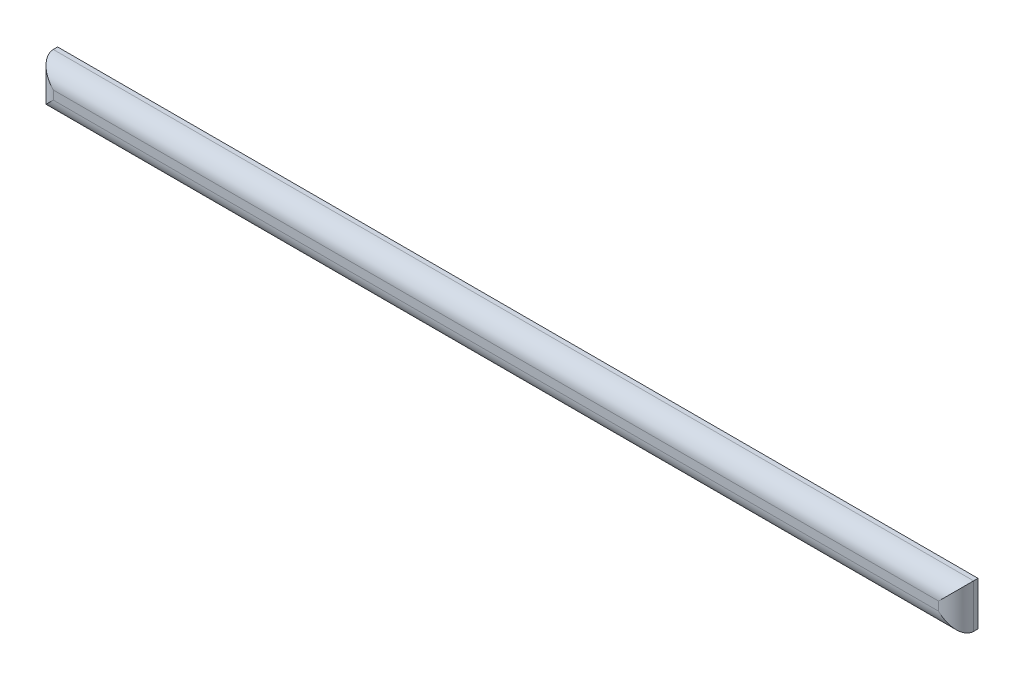
ISO-10303-21;
HEADER;
FILE_DESCRIPTION(('STEP AP214'),'2;1');
FILE_NAME('part.step','',(''),(''),'','','');
FILE_SCHEMA(('AUTOMOTIVE_DESIGN { 1 0 10303 214 1 1 1 1 }'));
ENDSEC;
DATA;
#1=APPLICATION_CONTEXT('core data for automotive mechanical design processes');
#2=APPLICATION_PROTOCOL_DEFINITION('international standard','automotive_design',2000,#1);
#3=PRODUCT_CONTEXT('',#1,'mechanical');
#4=PRODUCT('Part','Part','',(#3));
#5=PRODUCT_RELATED_PRODUCT_CATEGORY('part','',(#4));
#6=PRODUCT_DEFINITION_FORMATION('','',#4);
#7=PRODUCT_DEFINITION_CONTEXT('part definition',#1,'design');
#8=PRODUCT_DEFINITION('design','',#6,#7);
#9=PRODUCT_DEFINITION_SHAPE('','',#8);
#10=(LENGTH_UNIT() NAMED_UNIT(*) SI_UNIT(.MILLI.,.METRE.));
#11=(NAMED_UNIT(*) PLANE_ANGLE_UNIT() SI_UNIT($,.RADIAN.));
#12=(NAMED_UNIT(*) SI_UNIT($,.STERADIAN.) SOLID_ANGLE_UNIT());
#13=UNCERTAINTY_MEASURE_WITH_UNIT(LENGTH_MEASURE(1.E-05),#10,'distance_accuracy_value','');
#14=(GEOMETRIC_REPRESENTATION_CONTEXT(3) GLOBAL_UNCERTAINTY_ASSIGNED_CONTEXT((#13)) GLOBAL_UNIT_ASSIGNED_CONTEXT((#10,
#11,#12)) REPRESENTATION_CONTEXT('',''));
#15=CARTESIAN_POINT('',(0.,0.,0.));
#16=DIRECTION('',(0.,0.,1.));
#17=DIRECTION('',(1.,0.,0.));
#18=AXIS2_PLACEMENT_3D('',#15,#16,#17);
#19=CARTESIAN_POINT('',(202.,0.,2.));
#20=DIRECTION('',(0.,1.,0.));
#21=DIRECTION('',(0.,0.,1.));
#22=AXIS2_PLACEMENT_3D('',#19,#20,#21);
#23=CYLINDRICAL_SURFACE('',#22,8.);
#24=CARTESIAN_POINT('',(202.,-2.,10.));
#25=CARTESIAN_POINT('',(206.686291501015,-6.68629150101524,10.));
#26=CARTESIAN_POINT('',(210.,-9.99999999999999,6.68629150101524));
#27=CARTESIAN_POINT('',(210.,-10.,2.));
#28=(BOUNDED_CURVE() B_SPLINE_CURVE(3,(#24,#25,#26,#27),.UNSPECIFIED.,.F.,
.F.) B_SPLINE_CURVE_WITH_KNOTS((4,4),(4.71238898038469,6.28318530717959),
.UNSPECIFIED.) CURVE() GEOMETRIC_REPRESENTATION_ITEM() RATIONAL_B_SPLINE_CURVE((1.,
0.804737854124365,0.804737854124365,1.)) REPRESENTATION_ITEM(''));
#29=CARTESIAN_POINT('',(202.,-2.,10.));
#30=VERTEX_POINT('',#29);
#31=CARTESIAN_POINT('',(210.,-10.,2.));
#32=VERTEX_POINT('',#31);
#33=EDGE_CURVE('E30',#30,#32,#28,.T.);
#34=ORIENTED_EDGE('',*,*,#33,.T.);
#35=DIRECTION('',(0.,-1.,0.));
#36=VECTOR('',#35,1.);
#37=CARTESIAN_POINT('',(210.,-10.,2.));
#38=LINE('',#37,#36);
#39=CARTESIAN_POINT('',(210.,10.,2.));
#40=VERTEX_POINT('',#39);
#41=EDGE_CURVE('E127',#40,#32,#38,.T.);
#42=ORIENTED_EDGE('',*,*,#41,.F.);
#43=CARTESIAN_POINT('',(210.,10.,2.));
#44=CARTESIAN_POINT('',(210.,10.,6.68629150101524));
#45=CARTESIAN_POINT('',(206.686291501015,6.68629150101524,10.));
#46=CARTESIAN_POINT('',(202.,2.,10.));
#47=(BOUNDED_CURVE() B_SPLINE_CURVE(3,(#43,#44,#45,#46),.UNSPECIFIED.,.F.,
.F.) B_SPLINE_CURVE_WITH_KNOTS((4,4),(3.1415926535898,4.71238898038469),
.UNSPECIFIED.) CURVE() GEOMETRIC_REPRESENTATION_ITEM() RATIONAL_B_SPLINE_CURVE((1.,
0.804737854124365,0.804737854124365,1.)) REPRESENTATION_ITEM(''));
#48=CARTESIAN_POINT('',(202.,2.,10.));
#49=VERTEX_POINT('',#48);
#50=EDGE_CURVE('E11',#40,#49,#47,.T.);
#51=ORIENTED_EDGE('',*,*,#50,.T.);
#52=DIRECTION('',(0.,1.,0.));
#53=VECTOR('',#52,1.);
#54=CARTESIAN_POINT('',(202.,0.,10.));
#55=LINE('',#54,#53);
#56=EDGE_CURVE('E140',#30,#49,#55,.T.);
#57=ORIENTED_EDGE('',*,*,#56,.F.);
#58=EDGE_LOOP('',(#34,#42,#51,#57));
#59=FACE_BOUND('',#58,.T.);
#60=ADVANCED_FACE('F16',(#59),#23,.T.);
#61=CARTESIAN_POINT('',(0.,2.,2.));
#62=DIRECTION('',(-1.,0.,0.));
#63=DIRECTION('',(0.,0.,1.));
#64=AXIS2_PLACEMENT_3D('',#61,#62,#63);
#65=CYLINDRICAL_SURFACE('',#64,8.);
#66=CARTESIAN_POINT('',(-210.,10.,2.));
#67=CARTESIAN_POINT('',(-210.,10.,6.68629150101524));
#68=CARTESIAN_POINT('',(-206.686291501015,6.68629150101524,10.));
#69=CARTESIAN_POINT('',(-202.,2.,10.));
#70=(BOUNDED_CURVE() B_SPLINE_CURVE(3,(#66,#67,#68,#69),.UNSPECIFIED.,.F.,
.F.) B_SPLINE_CURVE_WITH_KNOTS((4,4),(0.,1.5707963267949),
.UNSPECIFIED.) CURVE() GEOMETRIC_REPRESENTATION_ITEM() RATIONAL_B_SPLINE_CURVE((1.,
0.804737854124365,0.804737854124365,1.)) REPRESENTATION_ITEM(''));
#71=CARTESIAN_POINT('',(-210.,10.,2.));
#72=VERTEX_POINT('',#71);
#73=CARTESIAN_POINT('',(-202.,2.,10.));
#74=VERTEX_POINT('',#73);
#75=EDGE_CURVE('E87',#72,#74,#70,.T.);
#76=ORIENTED_EDGE('',*,*,#75,.T.);
#77=DIRECTION('',(-1.,0.,0.));
#78=VECTOR('',#77,1.);
#79=CARTESIAN_POINT('',(0.,2.,10.));
#80=LINE('',#79,#78);
#81=EDGE_CURVE('E151',#49,#74,#80,.T.);
#82=ORIENTED_EDGE('',*,*,#81,.F.);
#83=ORIENTED_EDGE('',*,*,#50,.F.);
#84=DIRECTION('',(1.,0.,0.));
#85=VECTOR('',#84,1.);
#86=CARTESIAN_POINT('',(-210.,10.,2.));
#87=LINE('',#86,#85);
#88=EDGE_CURVE('E121',#72,#40,#87,.T.);
#89=ORIENTED_EDGE('',*,*,#88,.F.);
#90=EDGE_LOOP('',(#76,#82,#83,#89));
#91=FACE_BOUND('',#90,.T.);
#92=ADVANCED_FACE('F192',(#91),#65,.T.);
#93=CARTESIAN_POINT('',(0.,-2.,2.));
#94=DIRECTION('',(1.,0.,0.));
#95=DIRECTION('',(0.,0.,-1.));
#96=AXIS2_PLACEMENT_3D('',#93,#94,#95);
#97=CYLINDRICAL_SURFACE('',#96,8.);
#98=CARTESIAN_POINT('',(-202.,-2.,10.));
#99=CARTESIAN_POINT('',(-206.686291501015,-6.68629150101524,10.));
#100=CARTESIAN_POINT('',(-210.,-9.99999999999999,6.68629150101524));
#101=CARTESIAN_POINT('',(-210.,-10.,2.));
#102=(BOUNDED_CURVE() B_SPLINE_CURVE(3,(#98,#99,#100,#101),.UNSPECIFIED.,.F.,
.F.) B_SPLINE_CURVE_WITH_KNOTS((4,4),(1.5707963267949,3.1415926535898),
.UNSPECIFIED.) CURVE() GEOMETRIC_REPRESENTATION_ITEM() RATIONAL_B_SPLINE_CURVE((1.,
0.804737854124365,0.804737854124365,1.)) REPRESENTATION_ITEM(''));
#103=CARTESIAN_POINT('',(-202.,-2.,10.));
#104=VERTEX_POINT('',#103);
#105=CARTESIAN_POINT('',(-210.,-10.,2.));
#106=VERTEX_POINT('',#105);
#107=EDGE_CURVE('E77',#104,#106,#102,.T.);
#108=ORIENTED_EDGE('',*,*,#107,.T.);
#109=DIRECTION('',(-1.,0.,0.));
#110=VECTOR('',#109,1.);
#111=CARTESIAN_POINT('',(-210.,-10.,2.));
#112=LINE('',#111,#110);
#113=EDGE_CURVE('E76',#32,#106,#112,.T.);
#114=ORIENTED_EDGE('',*,*,#113,.F.);
#115=ORIENTED_EDGE('',*,*,#33,.F.);
#116=DIRECTION('',(1.,0.,0.));
#117=VECTOR('',#116,1.);
#118=CARTESIAN_POINT('',(0.,-2.,10.));
#119=LINE('',#118,#117);
#120=EDGE_CURVE('E85',#104,#30,#119,.T.);
#121=ORIENTED_EDGE('',*,*,#120,.F.);
#122=EDGE_LOOP('',(#108,#114,#115,#121));
#123=FACE_BOUND('',#122,.T.);
#124=ADVANCED_FACE('F79',(#123),#97,.T.);
#125=CARTESIAN_POINT('',(-202.,0.,2.));
#126=DIRECTION('',(0.,-1.,0.));
#127=DIRECTION('',(0.,0.,-1.));
#128=AXIS2_PLACEMENT_3D('',#125,#126,#127);
#129=CYLINDRICAL_SURFACE('',#128,8.);
#130=ORIENTED_EDGE('',*,*,#75,.F.);
#131=DIRECTION('',(0.,1.,0.));
#132=VECTOR('',#131,1.);
#133=CARTESIAN_POINT('',(-210.,-10.,2.));
#134=LINE('',#133,#132);
#135=EDGE_CURVE('E103',#106,#72,#134,.T.);
#136=ORIENTED_EDGE('',*,*,#135,.F.);
#137=ORIENTED_EDGE('',*,*,#107,.F.);
#138=DIRECTION('',(0.,-1.,0.));
#139=VECTOR('',#138,1.);
#140=CARTESIAN_POINT('',(-202.,0.,10.));
#141=LINE('',#140,#139);
#142=EDGE_CURVE('E139',#74,#104,#141,.T.);
#143=ORIENTED_EDGE('',*,*,#142,.F.);
#144=EDGE_LOOP('',(#130,#136,#137,#143));
#145=FACE_BOUND('',#144,.T.);
#146=ADVANCED_FACE('F102',(#145),#129,.T.);
#147=CARTESIAN_POINT('',(0.,0.,0.));
#148=DIRECTION('',(0.,0.,-1.));
#149=DIRECTION('',(0.,-1.,0.));
#150=AXIS2_PLACEMENT_3D('',#147,#148,#149);
#151=PLANE('',#150);
#152=DIRECTION('',(0.,1.,0.));
#153=VECTOR('',#152,1.);
#154=CARTESIAN_POINT('',(210.,-10.,0.));
#155=LINE('',#154,#153);
#156=CARTESIAN_POINT('',(210.,-10.,0.));
#157=VERTEX_POINT('',#156);
#158=CARTESIAN_POINT('',(210.,10.,0.));
#159=VERTEX_POINT('',#158);
#160=EDGE_CURVE('E128',#157,#159,#155,.T.);
#161=ORIENTED_EDGE('',*,*,#160,.F.);
#162=DIRECTION('',(1.,0.,0.));
#163=VECTOR('',#162,1.);
#164=CARTESIAN_POINT('',(-210.,-10.,0.));
#165=LINE('',#164,#163);
#166=CARTESIAN_POINT('',(-210.,-10.,0.));
#167=VERTEX_POINT('',#166);
#168=EDGE_CURVE('E99',#167,#157,#165,.T.);
#169=ORIENTED_EDGE('',*,*,#168,.F.);
#170=DIRECTION('',(0.,-1.,0.));
#171=VECTOR('',#170,1.);
#172=CARTESIAN_POINT('',(-210.,-10.,0.));
#173=LINE('',#172,#171);
#174=CARTESIAN_POINT('',(-210.,10.,0.));
#175=VERTEX_POINT('',#174);
#176=EDGE_CURVE('E97',#175,#167,#173,.T.);
#177=ORIENTED_EDGE('',*,*,#176,.F.);
#178=DIRECTION('',(-1.,0.,0.));
#179=VECTOR('',#178,1.);
#180=CARTESIAN_POINT('',(-210.,10.,0.));
#181=LINE('',#180,#179);
#182=EDGE_CURVE('E112',#159,#175,#181,.T.);
#183=ORIENTED_EDGE('',*,*,#182,.F.);
#184=EDGE_LOOP('',(#161,#169,#177,#183));
#185=FACE_BOUND('',#184,.T.);
#186=ADVANCED_FACE('F304',(#185),#151,.T.);
#187=CARTESIAN_POINT('',(0.,0.,10.));
#188=DIRECTION('',(0.,0.,-1.));
#189=DIRECTION('',(0.,-1.,0.));
#190=AXIS2_PLACEMENT_3D('',#187,#188,#189);
#191=PLANE('',#190);
#192=ORIENTED_EDGE('',*,*,#142,.T.);
#193=ORIENTED_EDGE('',*,*,#120,.T.);
#194=ORIENTED_EDGE('',*,*,#56,.T.);
#195=ORIENTED_EDGE('',*,*,#81,.T.);
#196=EDGE_LOOP('',(#192,#193,#194,#195));
#197=FACE_BOUND('',#196,.T.);
#198=ADVANCED_FACE('F294',(#197),#191,.F.);
#199=CARTESIAN_POINT('',(-210.,-10.,10.));
#200=DIRECTION('',(0.,1.,0.));
#201=DIRECTION('',(1.,0.,0.));
#202=AXIS2_PLACEMENT_3D('',#199,#200,#201);
#203=PLANE('',#202);
#204=DIRECTION('',(0.,0.,-1.));
#205=VECTOR('',#204,1.);
#206=CARTESIAN_POINT('',(210.,-10.,10.));
#207=LINE('',#206,#205);
#208=EDGE_CURVE('E98',#32,#157,#207,.T.);
#209=ORIENTED_EDGE('',*,*,#208,.F.);
#210=ORIENTED_EDGE('',*,*,#113,.T.);
#211=DIRECTION('',(0.,0.,-1.));
#212=VECTOR('',#211,1.);
#213=CARTESIAN_POINT('',(-210.,-10.,10.));
#214=LINE('',#213,#212);
#215=EDGE_CURVE('E95',#106,#167,#214,.T.);
#216=ORIENTED_EDGE('',*,*,#215,.T.);
#217=ORIENTED_EDGE('',*,*,#168,.T.);
#218=EDGE_LOOP('',(#209,#210,#216,#217));
#219=FACE_BOUND('',#218,.T.);
#220=ADVANCED_FACE('F92',(#219),#203,.F.);
#221=CARTESIAN_POINT('',(-210.,-10.,10.));
#222=DIRECTION('',(1.,0.,0.));
#223=DIRECTION('',(0.,1.,0.));
#224=AXIS2_PLACEMENT_3D('',#221,#222,#223);
#225=PLANE('',#224);
#226=ORIENTED_EDGE('',*,*,#215,.F.);
#227=ORIENTED_EDGE('',*,*,#135,.T.);
#228=DIRECTION('',(0.,0.,-1.));
#229=VECTOR('',#228,1.);
#230=CARTESIAN_POINT('',(-210.,10.,10.));
#231=LINE('',#230,#229);
#232=EDGE_CURVE('E132',#72,#175,#231,.T.);
#233=ORIENTED_EDGE('',*,*,#232,.T.);
#234=ORIENTED_EDGE('',*,*,#176,.T.);
#235=EDGE_LOOP('',(#226,#227,#233,#234));
#236=FACE_BOUND('',#235,.T.);
#237=ADVANCED_FACE('F111',(#236),#225,.F.);
#238=CARTESIAN_POINT('',(-210.,10.,10.));
#239=DIRECTION('',(0.,-1.,0.));
#240=DIRECTION('',(0.,0.,-1.));
#241=AXIS2_PLACEMENT_3D('',#238,#239,#240);
#242=PLANE('',#241);
#243=ORIENTED_EDGE('',*,*,#232,.F.);
#244=ORIENTED_EDGE('',*,*,#88,.T.);
#245=DIRECTION('',(0.,0.,-1.));
#246=VECTOR('',#245,1.);
#247=CARTESIAN_POINT('',(210.,10.,10.));
#248=LINE('',#247,#246);
#249=EDGE_CURVE('E125',#40,#159,#248,.T.);
#250=ORIENTED_EDGE('',*,*,#249,.T.);
#251=ORIENTED_EDGE('',*,*,#182,.T.);
#252=EDGE_LOOP('',(#243,#244,#250,#251));
#253=FACE_BOUND('',#252,.T.);
#254=ADVANCED_FACE('F199',(#253),#242,.F.);
#255=CARTESIAN_POINT('',(210.,-10.,10.));
#256=DIRECTION('',(-1.,0.,0.));
#257=DIRECTION('',(0.,0.,1.));
#258=AXIS2_PLACEMENT_3D('',#255,#256,#257);
#259=PLANE('',#258);
#260=ORIENTED_EDGE('',*,*,#249,.F.);
#261=ORIENTED_EDGE('',*,*,#41,.T.);
#262=ORIENTED_EDGE('',*,*,#208,.T.);
#263=ORIENTED_EDGE('',*,*,#160,.T.);
#264=EDGE_LOOP('',(#260,#261,#262,#263));
#265=FACE_BOUND('',#264,.T.);
#266=ADVANCED_FACE('F262',(#265),#259,.F.);
#267=CLOSED_SHELL('',(#60,#92,#124,#146,#186,#198,#220,#237,#254,#266));
#268=MANIFOLD_SOLID_BREP('B1',#267);
#269=ADVANCED_BREP_SHAPE_REPRESENTATION('',(#18,#268),#14);
#270=SHAPE_DEFINITION_REPRESENTATION(#9,#269);
ENDSEC;
END-ISO-10303-21;
